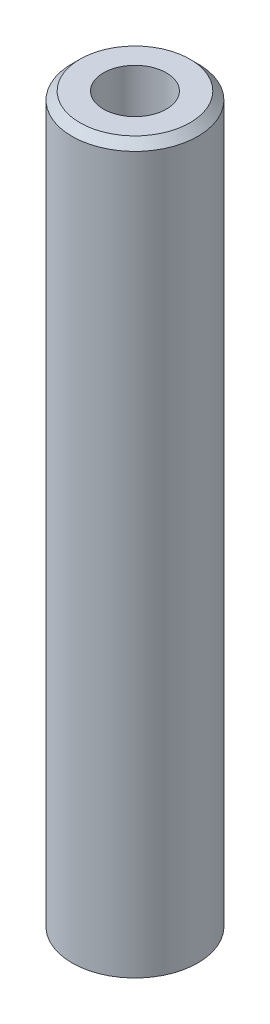
ISO-10303-21;
HEADER;
FILE_DESCRIPTION(('STEP AP214'),'2;1');
FILE_NAME('part.step','',(''),(''),'','','');
FILE_SCHEMA(('AUTOMOTIVE_DESIGN { 1 0 10303 214 1 1 1 1 }'));
ENDSEC;
DATA;
#1=APPLICATION_CONTEXT('core data for automotive mechanical design processes');
#2=APPLICATION_PROTOCOL_DEFINITION('international standard','automotive_design',2000,#1);
#3=PRODUCT_CONTEXT('',#1,'mechanical');
#4=PRODUCT('Part','Part','',(#3));
#5=PRODUCT_RELATED_PRODUCT_CATEGORY('part','',(#4));
#6=PRODUCT_DEFINITION_FORMATION('','',#4);
#7=PRODUCT_DEFINITION_CONTEXT('part definition',#1,'design');
#8=PRODUCT_DEFINITION('design','',#6,#7);
#9=PRODUCT_DEFINITION_SHAPE('','',#8);
#10=(LENGTH_UNIT() NAMED_UNIT(*) SI_UNIT(.MILLI.,.METRE.));
#11=(NAMED_UNIT(*) PLANE_ANGLE_UNIT() SI_UNIT($,.RADIAN.));
#12=(NAMED_UNIT(*) SI_UNIT($,.STERADIAN.) SOLID_ANGLE_UNIT());
#13=UNCERTAINTY_MEASURE_WITH_UNIT(LENGTH_MEASURE(1.E-05),#10,'distance_accuracy_value','');
#14=(GEOMETRIC_REPRESENTATION_CONTEXT(3) GLOBAL_UNCERTAINTY_ASSIGNED_CONTEXT((#13)) GLOBAL_UNIT_ASSIGNED_CONTEXT((#10,
#11,#12)) REPRESENTATION_CONTEXT('',''));
#15=CARTESIAN_POINT('',(0.,0.,0.));
#16=DIRECTION('',(0.,0.,1.));
#17=DIRECTION('',(1.,0.,0.));
#18=AXIS2_PLACEMENT_3D('',#15,#16,#17);
#19=CARTESIAN_POINT('',(0.,46.,0.));
#20=DIRECTION('',(0.,1.,0.));
#21=DIRECTION('',(0.,0.,1.));
#22=AXIS2_PLACEMENT_3D('',#19,#20,#21);
#23=PLANE('',#22);
#24=CARTESIAN_POINT('',(0.,46.,0.));
#25=DIRECTION('',(0.,1.,0.));
#26=DIRECTION('',(0.,0.,1.));
#27=AXIS2_PLACEMENT_3D('',#24,#25,#26);
#28=CIRCLE('',#27,3.5);
#29=CARTESIAN_POINT('',(0.,46.,3.5));
#30=VERTEX_POINT('',#29);
#31=EDGE_CURVE('E49',#30,#30,#28,.T.);
#32=ORIENTED_EDGE('',*,*,#31,.T.);
#33=EDGE_LOOP('',(#32));
#34=FACE_BOUND('',#33,.T.);
#35=CARTESIAN_POINT('',(0.,46.,0.));
#36=DIRECTION('',(0.,1.,0.));
#37=DIRECTION('',(0.,0.,1.));
#38=AXIS2_PLACEMENT_3D('',#35,#36,#37);
#39=CIRCLE('',#38,2.);
#40=CARTESIAN_POINT('',(0.,46.,2.));
#41=VERTEX_POINT('',#40);
#42=EDGE_CURVE('E57',#41,#41,#39,.T.);
#43=ORIENTED_EDGE('',*,*,#42,.F.);
#44=EDGE_LOOP('',(#43));
#45=FACE_BOUND('',#44,.T.);
#46=ADVANCED_FACE('F41',(#34,#45),#23,.T.);
#47=CARTESIAN_POINT('',(0.,0.,0.));
#48=DIRECTION('',(0.,1.,0.));
#49=DIRECTION('',(0.,0.,1.));
#50=AXIS2_PLACEMENT_3D('',#47,#48,#49);
#51=PLANE('',#50);
#52=CARTESIAN_POINT('',(0.,0.,0.));
#53=DIRECTION('',(0.,1.,0.));
#54=DIRECTION('',(0.,0.,1.));
#55=AXIS2_PLACEMENT_3D('',#52,#53,#54);
#56=CIRCLE('',#55,4.);
#57=CARTESIAN_POINT('',(0.,0.,4.));
#58=VERTEX_POINT('',#57);
#59=EDGE_CURVE('E53',#58,#58,#56,.T.);
#60=ORIENTED_EDGE('',*,*,#59,.F.);
#61=EDGE_LOOP('',(#60));
#62=FACE_BOUND('',#61,.T.);
#63=CARTESIAN_POINT('',(0.,0.,0.));
#64=DIRECTION('',(0.,1.,0.));
#65=DIRECTION('',(0.,0.,1.));
#66=AXIS2_PLACEMENT_3D('',#63,#64,#65);
#67=CIRCLE('',#66,2.);
#68=CARTESIAN_POINT('',(0.,0.,2.));
#69=VERTEX_POINT('',#68);
#70=EDGE_CURVE('E60',#69,#69,#67,.T.);
#71=ORIENTED_EDGE('',*,*,#70,.T.);
#72=EDGE_LOOP('',(#71));
#73=FACE_BOUND('',#72,.T.);
#74=ADVANCED_FACE('F70',(#62,#73),#51,.F.);
#75=CARTESIAN_POINT('',(0.,46.,0.));
#76=DIRECTION('',(0.,-1.,0.));
#77=DIRECTION('',(0.,0.,-1.));
#78=AXIS2_PLACEMENT_3D('',#75,#76,#77);
#79=CYLINDRICAL_SURFACE('',#78,4.);
#80=CARTESIAN_POINT('',(0.,45.5,0.));
#81=DIRECTION('',(0.,1.,0.));
#82=DIRECTION('',(0.,0.,1.));
#83=AXIS2_PLACEMENT_3D('',#80,#81,#82);
#84=CIRCLE('',#83,4.);
#85=CARTESIAN_POINT('',(0.,45.5,4.));
#86=VERTEX_POINT('',#85);
#87=EDGE_CURVE('E10',#86,#86,#84,.F.);
#88=ORIENTED_EDGE('',*,*,#87,.T.);
#89=EDGE_LOOP('',(#88));
#90=FACE_BOUND('',#89,.T.);
#91=ORIENTED_EDGE('',*,*,#59,.T.);
#92=EDGE_LOOP('',(#91));
#93=FACE_BOUND('',#92,.T.);
#94=ADVANCED_FACE('F77',(#90,#93),#79,.T.);
#95=CARTESIAN_POINT('',(0.,46.,0.));
#96=DIRECTION('',(0.,-1.,0.));
#97=DIRECTION('',(0.,0.,-1.));
#98=AXIS2_PLACEMENT_3D('',#95,#96,#97);
#99=CYLINDRICAL_SURFACE('',#98,2.);
#100=ORIENTED_EDGE('',*,*,#42,.T.);
#101=EDGE_LOOP('',(#100));
#102=FACE_BOUND('',#101,.T.);
#103=ORIENTED_EDGE('',*,*,#70,.F.);
#104=EDGE_LOOP('',(#103));
#105=FACE_BOUND('',#104,.T.);
#106=ADVANCED_FACE('F66',(#102,#105),#99,.F.);
#107=CARTESIAN_POINT('',(0.,46.,0.));
#108=DIRECTION('',(0.,-1.,0.));
#109=DIRECTION('',(0.,0.,-1.));
#110=AXIS2_PLACEMENT_3D('',#107,#108,#109);
#111=CONICAL_SURFACE('',#110,3.5,0.785398163397438);
#112=ORIENTED_EDGE('',*,*,#87,.F.);
#113=EDGE_LOOP('',(#112));
#114=FACE_BOUND('',#113,.T.);
#115=ORIENTED_EDGE('',*,*,#31,.F.);
#116=EDGE_LOOP('',(#115));
#117=FACE_BOUND('',#116,.T.);
#118=ADVANCED_FACE('F44',(#114,#117),#111,.T.);
#119=CLOSED_SHELL('',(#46,#74,#94,#106,#118));
#120=MANIFOLD_SOLID_BREP('B2',#119);
#121=ADVANCED_BREP_SHAPE_REPRESENTATION('',(#18,#120),#14);
#122=SHAPE_DEFINITION_REPRESENTATION(#9,#121);
ENDSEC;
END-ISO-10303-21;
